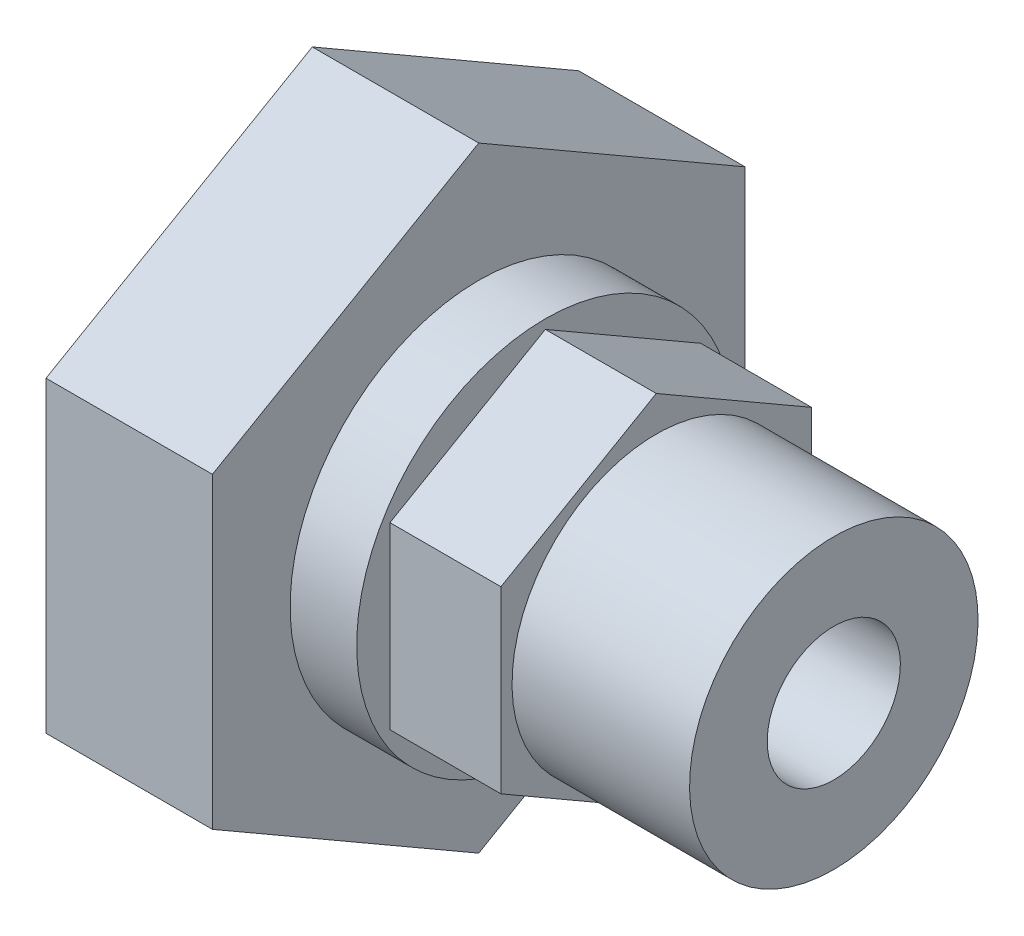
ISO-10303-21;
HEADER;
FILE_DESCRIPTION(('STEP AP214'),'2;1');
FILE_NAME('part.step','',(''),(''),'','','');
FILE_SCHEMA(('AUTOMOTIVE_DESIGN { 1 0 10303 214 1 1 1 1 }'));
ENDSEC;
DATA;
#1=APPLICATION_CONTEXT('core data for automotive mechanical design processes');
#2=APPLICATION_PROTOCOL_DEFINITION('international standard','automotive_design',2000,#1);
#3=PRODUCT_CONTEXT('',#1,'mechanical');
#4=PRODUCT('Part','Part','',(#3));
#5=PRODUCT_RELATED_PRODUCT_CATEGORY('part','',(#4));
#6=PRODUCT_DEFINITION_FORMATION('','',#4);
#7=PRODUCT_DEFINITION_CONTEXT('part definition',#1,'design');
#8=PRODUCT_DEFINITION('design','',#6,#7);
#9=PRODUCT_DEFINITION_SHAPE('','',#8);
#10=(LENGTH_UNIT() NAMED_UNIT(*) SI_UNIT(.MILLI.,.METRE.));
#11=(NAMED_UNIT(*) PLANE_ANGLE_UNIT() SI_UNIT($,.RADIAN.));
#12=(NAMED_UNIT(*) SI_UNIT($,.STERADIAN.) SOLID_ANGLE_UNIT());
#13=UNCERTAINTY_MEASURE_WITH_UNIT(LENGTH_MEASURE(1.E-05),#10,'distance_accuracy_value','');
#14=(GEOMETRIC_REPRESENTATION_CONTEXT(3) GLOBAL_UNCERTAINTY_ASSIGNED_CONTEXT((#13)) GLOBAL_UNIT_ASSIGNED_CONTEXT((#10,
#11,#12)) REPRESENTATION_CONTEXT('',''));
#15=CARTESIAN_POINT('',(0.,0.,0.));
#16=DIRECTION('',(0.,0.,1.));
#17=DIRECTION('',(1.,0.,0.));
#18=AXIS2_PLACEMENT_3D('',#15,#16,#17);
#19=CARTESIAN_POINT('',(15.5,4.04145188432727,-7.));
#20=DIRECTION('',(-1.,0.,0.));
#21=DIRECTION('',(0.,-1.,0.));
#22=AXIS2_PLACEMENT_3D('',#19,#20,#21);
#23=PLANE('',#22);
#24=CARTESIAN_POINT('',(15.5,0.,0.));
#25=DIRECTION('',(-1.,0.,0.));
#26=DIRECTION('',(0.,-1.,0.));
#27=AXIS2_PLACEMENT_3D('',#24,#25,#26);
#28=CIRCLE('',#27,6.50000000000001);
#29=CARTESIAN_POINT('',(15.5,-6.50000000000001,0.));
#30=VERTEX_POINT('',#29);
#31=EDGE_CURVE('E21',#30,#30,#28,.F.);
#32=ORIENTED_EDGE('',*,*,#31,.F.);
#33=EDGE_LOOP('',(#32));
#34=FACE_BOUND('',#33,.T.);
#35=DIRECTION('',(0.,0.499999999999999,-0.866025403784439));
#36=VECTOR('',#35,1.);
#37=CARTESIAN_POINT('',(15.5,8.08290376865478,0.));
#38=LINE('',#37,#36);
#39=CARTESIAN_POINT('',(15.5,8.08290376865476,0.));
#40=VERTEX_POINT('',#39);
#41=CARTESIAN_POINT('',(15.5,4.04145188432745,7.));
#42=VERTEX_POINT('',#41);
#43=EDGE_CURVE('E109',#40,#42,#38,.F.);
#44=ORIENTED_EDGE('',*,*,#43,.T.);
#45=DIRECTION('',(0.,1.,0.));
#46=VECTOR('',#45,1.);
#47=CARTESIAN_POINT('',(15.5,4.04145188432747,7.00000000000002));
#48=LINE('',#47,#46);
#49=CARTESIAN_POINT('',(15.5,-4.04145188432736,7.));
#50=VERTEX_POINT('',#49);
#51=EDGE_CURVE('E174',#42,#50,#48,.F.);
#52=ORIENTED_EDGE('',*,*,#51,.T.);
#53=DIRECTION('',(0.,0.500000000000001,0.866025403784438));
#54=VECTOR('',#53,1.);
#55=CARTESIAN_POINT('',(15.5,-4.04145188432736,7.));
#56=LINE('',#55,#54);
#57=CARTESIAN_POINT('',(15.5,-8.08290376865473,0.));
#58=VERTEX_POINT('',#57);
#59=EDGE_CURVE('E179',#50,#58,#56,.F.);
#60=ORIENTED_EDGE('',*,*,#59,.T.);
#61=DIRECTION('',(0.,-0.499999999999999,0.866025403784439));
#62=VECTOR('',#61,1.);
#63=CARTESIAN_POINT('',(15.5,-8.08290376865473,0.));
#64=LINE('',#63,#62);
#65=CARTESIAN_POINT('',(15.5,-4.04145188432746,-7.));
#66=VERTEX_POINT('',#65);
#67=EDGE_CURVE('E183',#58,#66,#64,.F.);
#68=ORIENTED_EDGE('',*,*,#67,.T.);
#69=DIRECTION('',(0.,-1.,0.));
#70=VECTOR('',#69,1.);
#71=CARTESIAN_POINT('',(15.5,-4.04145188432747,-7.00000000000002));
#72=LINE('',#71,#70);
#73=CARTESIAN_POINT('',(15.5,4.04145188432727,-7.));
#74=VERTEX_POINT('',#73);
#75=EDGE_CURVE('E105',#66,#74,#72,.F.);
#76=ORIENTED_EDGE('',*,*,#75,.T.);
#77=DIRECTION('',(0.,-0.500000000000001,-0.866025403784438));
#78=VECTOR('',#77,1.);
#79=CARTESIAN_POINT('',(15.5,4.04145188432727,-7.));
#80=LINE('',#79,#78);
#81=EDGE_CURVE('E107',#74,#40,#80,.F.);
#82=ORIENTED_EDGE('',*,*,#81,.T.);
#83=EDGE_LOOP('',(#44,#52,#60,#68,#76,#82));
#84=FACE_BOUND('',#83,.T.);
#85=ADVANCED_FACE('F18',(#34,#84),#23,.F.);
#86=CARTESIAN_POINT('',(15.5,8.08290376865478,0.));
#87=DIRECTION('',(0.,-0.866025403784439,-0.499999999999999));
#88=DIRECTION('',(0.,0.499999999999999,-0.866025403784439));
#89=AXIS2_PLACEMENT_3D('',#86,#87,#88);
#90=PLANE('',#89);
#91=DIRECTION('',(1.,0.,0.));
#92=VECTOR('',#91,1.);
#93=CARTESIAN_POINT('',(15.5,4.04145188432747,7.00000000000002));
#94=LINE('',#93,#92);
#95=CARTESIAN_POINT('',(10.5,4.04145188432745,7.));
#96=VERTEX_POINT('',#95);
#97=EDGE_CURVE('E120',#96,#42,#94,.T.);
#98=ORIENTED_EDGE('',*,*,#97,.T.);
#99=ORIENTED_EDGE('',*,*,#43,.F.);
#100=DIRECTION('',(1.,0.,0.));
#101=VECTOR('',#100,1.);
#102=CARTESIAN_POINT('',(15.5,8.08290376865469,0.));
#103=LINE('',#102,#101);
#104=CARTESIAN_POINT('',(10.5,8.08290376865476,0.));
#105=VERTEX_POINT('',#104);
#106=EDGE_CURVE('E114',#40,#105,#103,.F.);
#107=ORIENTED_EDGE('',*,*,#106,.T.);
#108=DIRECTION('',(0.,0.499999999999994,-0.866025403784442));
#109=VECTOR('',#108,1.);
#110=CARTESIAN_POINT('',(10.5,4.04145188432747,7.00000000000002));
#111=LINE('',#110,#109);
#112=EDGE_CURVE('E170',#96,#105,#111,.T.);
#113=ORIENTED_EDGE('',*,*,#112,.F.);
#114=EDGE_LOOP('',(#98,#99,#107,#113));
#115=FACE_BOUND('',#114,.T.);
#116=ADVANCED_FACE('F117',(#115),#90,.F.);
#117=CARTESIAN_POINT('',(15.5,4.04145188432727,-7.));
#118=DIRECTION('',(0.,-0.866025403784438,0.500000000000001));
#119=DIRECTION('',(0.,-0.500000000000001,-0.866025403784438));
#120=AXIS2_PLACEMENT_3D('',#117,#118,#119);
#121=PLANE('',#120);
#122=ORIENTED_EDGE('',*,*,#106,.F.);
#123=ORIENTED_EDGE('',*,*,#81,.F.);
#124=DIRECTION('',(1.,0.,0.));
#125=VECTOR('',#124,1.);
#126=CARTESIAN_POINT('',(15.5,4.04145188432727,-7.00000000000001));
#127=LINE('',#126,#125);
#128=CARTESIAN_POINT('',(10.5,4.04145188432727,-7.));
#129=VERTEX_POINT('',#128);
#130=EDGE_CURVE('E128',#74,#129,#127,.F.);
#131=ORIENTED_EDGE('',*,*,#130,.T.);
#132=DIRECTION('',(0.,-0.500000000000012,-0.866025403784432));
#133=VECTOR('',#132,1.);
#134=CARTESIAN_POINT('',(10.5,8.08290376865478,0.));
#135=LINE('',#134,#133);
#136=EDGE_CURVE('E125',#105,#129,#135,.T.);
#137=ORIENTED_EDGE('',*,*,#136,.F.);
#138=EDGE_LOOP('',(#122,#123,#131,#137));
#139=FACE_BOUND('',#138,.T.);
#140=ADVANCED_FACE('F123',(#139),#121,.F.);
#141=CARTESIAN_POINT('',(15.5,-4.04145188432747,-7.00000000000002));
#142=DIRECTION('',(0.,0.,1.));
#143=DIRECTION('',(0.,-1.,0.));
#144=AXIS2_PLACEMENT_3D('',#141,#142,#143);
#145=PLANE('',#144);
#146=ORIENTED_EDGE('',*,*,#130,.F.);
#147=ORIENTED_EDGE('',*,*,#75,.F.);
#148=DIRECTION('',(1.,0.,0.));
#149=VECTOR('',#148,1.);
#150=CARTESIAN_POINT('',(15.5,-4.04145188432739,-6.99999999999998));
#151=LINE('',#150,#149);
#152=CARTESIAN_POINT('',(10.5,-4.04145188432746,-7.));
#153=VERTEX_POINT('',#152);
#154=EDGE_CURVE('E181',#66,#153,#151,.F.);
#155=ORIENTED_EDGE('',*,*,#154,.T.);
#156=DIRECTION('',(0.,1.,0.));
#157=VECTOR('',#156,1.);
#158=CARTESIAN_POINT('',(10.5,0.,-7.));
#159=LINE('',#158,#157);
#160=EDGE_CURVE('E166',#129,#153,#159,.F.);
#161=ORIENTED_EDGE('',*,*,#160,.F.);
#162=EDGE_LOOP('',(#146,#147,#155,#161));
#163=FACE_BOUND('',#162,.T.);
#164=ADVANCED_FACE('F186',(#163),#145,.F.);
#165=CARTESIAN_POINT('',(15.5,-8.08290376865473,0.));
#166=DIRECTION('',(0.,0.866025403784439,0.499999999999999));
#167=DIRECTION('',(0.,-0.499999999999999,0.866025403784439));
#168=AXIS2_PLACEMENT_3D('',#165,#166,#167);
#169=PLANE('',#168);
#170=ORIENTED_EDGE('',*,*,#154,.F.);
#171=ORIENTED_EDGE('',*,*,#67,.F.);
#172=DIRECTION('',(1.,0.,0.));
#173=VECTOR('',#172,1.);
#174=CARTESIAN_POINT('',(15.5,-8.08290376865476,0.));
#175=LINE('',#174,#173);
#176=CARTESIAN_POINT('',(10.5,-8.08290376865473,0.));
#177=VERTEX_POINT('',#176);
#178=EDGE_CURVE('E177',#58,#177,#175,.F.);
#179=ORIENTED_EDGE('',*,*,#178,.T.);
#180=DIRECTION('',(0.,-0.499999999999988,0.866025403784446));
#181=VECTOR('',#180,1.);
#182=CARTESIAN_POINT('',(10.5,-4.04145188432747,-7.00000000000002));
#183=LINE('',#182,#181);
#184=EDGE_CURVE('E159',#153,#177,#183,.T.);
#185=ORIENTED_EDGE('',*,*,#184,.F.);
#186=EDGE_LOOP('',(#170,#171,#179,#185));
#187=FACE_BOUND('',#186,.T.);
#188=ADVANCED_FACE('F201',(#187),#169,.F.);
#189=CARTESIAN_POINT('',(15.5,-4.04145188432736,7.));
#190=DIRECTION('',(0.,0.866025403784438,-0.500000000000001));
#191=DIRECTION('',(0.,0.500000000000001,0.866025403784438));
#192=AXIS2_PLACEMENT_3D('',#189,#190,#191);
#193=PLANE('',#192);
#194=ORIENTED_EDGE('',*,*,#178,.F.);
#195=ORIENTED_EDGE('',*,*,#59,.F.);
#196=DIRECTION('',(1.,0.,0.));
#197=VECTOR('',#196,1.);
#198=CARTESIAN_POINT('',(15.5,-4.04145188432736,7.));
#199=LINE('',#198,#197);
#200=CARTESIAN_POINT('',(10.5,-4.04145188432736,7.));
#201=VERTEX_POINT('',#200);
#202=EDGE_CURVE('E172',#50,#201,#199,.F.);
#203=ORIENTED_EDGE('',*,*,#202,.T.);
#204=DIRECTION('',(0.,0.499999999999997,0.86602540378444));
#205=VECTOR('',#204,1.);
#206=CARTESIAN_POINT('',(10.5,-8.08290376865473,0.));
#207=LINE('',#206,#205);
#208=EDGE_CURVE('E154',#177,#201,#207,.T.);
#209=ORIENTED_EDGE('',*,*,#208,.F.);
#210=EDGE_LOOP('',(#194,#195,#203,#209));
#211=FACE_BOUND('',#210,.T.);
#212=ADVANCED_FACE('F198',(#211),#193,.F.);
#213=CARTESIAN_POINT('',(15.5,4.04145188432747,7.00000000000002));
#214=DIRECTION('',(0.,0.,-1.));
#215=DIRECTION('',(0.,1.,0.));
#216=AXIS2_PLACEMENT_3D('',#213,#214,#215);
#217=PLANE('',#216);
#218=ORIENTED_EDGE('',*,*,#202,.F.);
#219=ORIENTED_EDGE('',*,*,#51,.F.);
#220=ORIENTED_EDGE('',*,*,#97,.F.);
#221=DIRECTION('',(0.,1.,0.));
#222=VECTOR('',#221,1.);
#223=CARTESIAN_POINT('',(10.5,0.,7.));
#224=LINE('',#223,#222);
#225=EDGE_CURVE('E150',#201,#96,#224,.T.);
#226=ORIENTED_EDGE('',*,*,#225,.F.);
#227=EDGE_LOOP('',(#218,#219,#220,#226));
#228=FACE_BOUND('',#227,.T.);
#229=ADVANCED_FACE('F193',(#228),#217,.F.);
#230=CARTESIAN_POINT('',(23.5,0.,0.));
#231=DIRECTION('',(-1.,0.,0.));
#232=DIRECTION('',(0.,-1.,0.));
#233=AXIS2_PLACEMENT_3D('',#230,#231,#232);
#234=CYLINDRICAL_SURFACE('',#233,6.50000000000001);
#235=ORIENTED_EDGE('',*,*,#31,.T.);
#236=EDGE_LOOP('',(#235));
#237=FACE_BOUND('',#236,.T.);
#238=CARTESIAN_POINT('',(23.5,0.,0.));
#239=DIRECTION('',(-1.,0.,0.));
#240=DIRECTION('',(0.,-1.,0.));
#241=AXIS2_PLACEMENT_3D('',#238,#239,#240);
#242=CIRCLE('',#241,6.50000000000001);
#243=CARTESIAN_POINT('',(23.5,-6.50000000000001,0.));
#244=VERTEX_POINT('',#243);
#245=EDGE_CURVE('E148',#244,#244,#242,.F.);
#246=ORIENTED_EDGE('',*,*,#245,.F.);
#247=EDGE_LOOP('',(#246));
#248=FACE_BOUND('',#247,.T.);
#249=ADVANCED_FACE('F268',(#237,#248),#234,.T.);
#250=CARTESIAN_POINT('',(10.5,0.,0.));
#251=DIRECTION('',(1.,0.,0.));
#252=DIRECTION('',(0.,1.,0.));
#253=AXIS2_PLACEMENT_3D('',#250,#251,#252);
#254=PLANE('',#253);
#255=ORIENTED_EDGE('',*,*,#208,.T.);
#256=ORIENTED_EDGE('',*,*,#225,.T.);
#257=ORIENTED_EDGE('',*,*,#112,.T.);
#258=ORIENTED_EDGE('',*,*,#136,.T.);
#259=ORIENTED_EDGE('',*,*,#160,.T.);
#260=ORIENTED_EDGE('',*,*,#184,.T.);
#261=EDGE_LOOP('',(#255,#256,#257,#258,#259,#260));
#262=FACE_BOUND('',#261,.T.);
#263=CARTESIAN_POINT('',(10.5,0.,0.));
#264=DIRECTION('',(-1.,0.,0.));
#265=DIRECTION('',(0.,-1.,0.));
#266=AXIS2_PLACEMENT_3D('',#263,#264,#265);
#267=CIRCLE('',#266,8.50000000000002);
#268=CARTESIAN_POINT('',(10.5,-8.50000000000002,0.));
#269=VERTEX_POINT('',#268);
#270=EDGE_CURVE('E146',#269,#269,#267,.T.);
#271=ORIENTED_EDGE('',*,*,#270,.F.);
#272=EDGE_LOOP('',(#271));
#273=FACE_BOUND('',#272,.T.);
#274=ADVANCED_FACE('F189',(#262,#273),#254,.T.);
#275=CARTESIAN_POINT('',(23.5,0.,0.));
#276=DIRECTION('',(1.,0.,0.));
#277=DIRECTION('',(0.,1.,0.));
#278=AXIS2_PLACEMENT_3D('',#275,#276,#277);
#279=PLANE('',#278);
#280=CARTESIAN_POINT('',(23.5,0.,0.));
#281=DIRECTION('',(-1.,0.,0.));
#282=DIRECTION('',(0.,-1.,0.));
#283=AXIS2_PLACEMENT_3D('',#280,#281,#282);
#284=CIRCLE('',#283,3.00000000000001);
#285=CARTESIAN_POINT('',(23.5,-3.00000000000001,0.));
#286=VERTEX_POINT('',#285);
#287=EDGE_CURVE('E143',#286,#286,#284,.T.);
#288=ORIENTED_EDGE('',*,*,#287,.T.);
#289=EDGE_LOOP('',(#288));
#290=FACE_BOUND('',#289,.T.);
#291=ORIENTED_EDGE('',*,*,#245,.T.);
#292=EDGE_LOOP('',(#291));
#293=FACE_BOUND('',#292,.T.);
#294=ADVANCED_FACE('F261',(#290,#293),#279,.T.);
#295=CARTESIAN_POINT('',(10.5,0.,0.));
#296=DIRECTION('',(-1.,0.,0.));
#297=DIRECTION('',(0.,-1.,0.));
#298=AXIS2_PLACEMENT_3D('',#295,#296,#297);
#299=CYLINDRICAL_SURFACE('',#298,8.50000000000002);
#300=ORIENTED_EDGE('',*,*,#270,.T.);
#301=EDGE_LOOP('',(#300));
#302=FACE_BOUND('',#301,.T.);
#303=CARTESIAN_POINT('',(7.50000000000001,0.,0.));
#304=DIRECTION('',(-1.,0.,0.));
#305=DIRECTION('',(0.,-1.,0.));
#306=AXIS2_PLACEMENT_3D('',#303,#304,#305);
#307=CIRCLE('',#306,8.50000000000002);
#308=CARTESIAN_POINT('',(7.50000000000001,-8.50000000000002,0.));
#309=VERTEX_POINT('',#308);
#310=EDGE_CURVE('E140',#309,#309,#307,.F.);
#311=ORIENTED_EDGE('',*,*,#310,.T.);
#312=EDGE_LOOP('',(#311));
#313=FACE_BOUND('',#312,.T.);
#314=ADVANCED_FACE('F257',(#302,#313),#299,.T.);
#315=CARTESIAN_POINT('',(23.5,0.,0.));
#316=DIRECTION('',(-1.,0.,0.));
#317=DIRECTION('',(0.,-1.,0.));
#318=AXIS2_PLACEMENT_3D('',#315,#316,#317);
#319=CYLINDRICAL_SURFACE('',#318,3.00000000000001);
#320=CARTESIAN_POINT('',(15.5,0.,0.));
#321=DIRECTION('',(-1.,0.,0.));
#322=DIRECTION('',(0.,-1.,0.));
#323=AXIS2_PLACEMENT_3D('',#320,#321,#322);
#324=CIRCLE('',#323,3.00000000000001);
#325=CARTESIAN_POINT('',(15.5,-3.00000000000001,0.));
#326=VERTEX_POINT('',#325);
#327=EDGE_CURVE('E136',#326,#326,#324,.T.);
#328=ORIENTED_EDGE('',*,*,#327,.T.);
#329=EDGE_LOOP('',(#328));
#330=FACE_BOUND('',#329,.T.);
#331=ORIENTED_EDGE('',*,*,#287,.F.);
#332=EDGE_LOOP('',(#331));
#333=FACE_BOUND('',#332,.T.);
#334=ADVANCED_FACE('F253',(#330,#333),#319,.F.);
#335=CARTESIAN_POINT('',(7.50000000000001,6.92820323027554,-12.));
#336=DIRECTION('',(-1.,0.,0.));
#337=DIRECTION('',(0.,-1.,0.));
#338=AXIS2_PLACEMENT_3D('',#335,#336,#337);
#339=PLANE('',#338);
#340=ORIENTED_EDGE('',*,*,#310,.F.);
#341=EDGE_LOOP('',(#340));
#342=FACE_BOUND('',#341,.T.);
#343=DIRECTION('',(0.,0.499999999999999,-0.866025403784439));
#344=VECTOR('',#343,1.);
#345=CARTESIAN_POINT('',(7.50000000000001,13.856406460551,0.));
#346=LINE('',#345,#344);
#347=CARTESIAN_POINT('',(7.50000000000001,13.856406460551,0.));
#348=VERTEX_POINT('',#347);
#349=CARTESIAN_POINT('',(7.50000000000001,6.92820323027551,12.));
#350=VERTEX_POINT('',#349);
#351=EDGE_CURVE('E426',#348,#350,#346,.F.);
#352=ORIENTED_EDGE('',*,*,#351,.T.);
#353=DIRECTION('',(0.,1.,0.));
#354=VECTOR('',#353,1.);
#355=CARTESIAN_POINT('',(7.50000000000001,6.92820323027549,12.));
#356=LINE('',#355,#354);
#357=CARTESIAN_POINT('',(7.50000000000001,-6.92820323027554,12.));
#358=VERTEX_POINT('',#357);
#359=EDGE_CURVE('E427',#350,#358,#356,.F.);
#360=ORIENTED_EDGE('',*,*,#359,.T.);
#361=DIRECTION('',(0.,0.500000000000001,0.866025403784438));
#362=VECTOR('',#361,1.);
#363=CARTESIAN_POINT('',(7.50000000000001,-6.92820323027554,12.));
#364=LINE('',#363,#362);
#365=CARTESIAN_POINT('',(7.50000000000001,-13.8564064605511,0.));
#366=VERTEX_POINT('',#365);
#367=EDGE_CURVE('E447',#358,#366,#364,.F.);
#368=ORIENTED_EDGE('',*,*,#367,.T.);
#369=DIRECTION('',(0.,-0.499999999999999,0.866025403784439));
#370=VECTOR('',#369,1.);
#371=CARTESIAN_POINT('',(7.50000000000001,-13.8564064605511,0.));
#372=LINE('',#371,#370);
#373=CARTESIAN_POINT('',(7.50000000000001,-6.92820323027556,-12.));
#374=VERTEX_POINT('',#373);
#375=EDGE_CURVE('E451',#366,#374,#372,.F.);
#376=ORIENTED_EDGE('',*,*,#375,.T.);
#377=DIRECTION('',(0.,-1.,0.));
#378=VECTOR('',#377,1.);
#379=CARTESIAN_POINT('',(7.50000000000001,-6.92820323027554,-12.));
#380=LINE('',#379,#378);
#381=CARTESIAN_POINT('',(7.50000000000001,6.92820323027554,-12.));
#382=VERTEX_POINT('',#381);
#383=EDGE_CURVE('E454',#374,#382,#380,.F.);
#384=ORIENTED_EDGE('',*,*,#383,.T.);
#385=DIRECTION('',(0.,-0.500000000000001,-0.866025403784438));
#386=VECTOR('',#385,1.);
#387=CARTESIAN_POINT('',(7.50000000000001,6.92820323027554,-12.));
#388=LINE('',#387,#386);
#389=EDGE_CURVE('E139',#382,#348,#388,.F.);
#390=ORIENTED_EDGE('',*,*,#389,.T.);
#391=EDGE_LOOP('',(#352,#360,#368,#376,#384,#390));
#392=FACE_BOUND('',#391,.T.);
#393=ADVANCED_FACE('F249',(#342,#392),#339,.F.);
#394=CARTESIAN_POINT('',(15.5,0.,0.));
#395=DIRECTION('',(1.,0.,0.));
#396=DIRECTION('',(0.,1.,0.));
#397=AXIS2_PLACEMENT_3D('',#394,#395,#396);
#398=PLANE('',#397);
#399=ORIENTED_EDGE('',*,*,#327,.F.);
#400=EDGE_LOOP('',(#399));
#401=FACE_BOUND('',#400,.T.);
#402=CARTESIAN_POINT('',(15.5,0.,0.));
#403=DIRECTION('',(-1.,0.,0.));
#404=DIRECTION('',(0.,-1.,0.));
#405=AXIS2_PLACEMENT_3D('',#402,#403,#404);
#406=CIRCLE('',#405,4.00000000000001);
#407=CARTESIAN_POINT('',(15.5,-4.00000000000001,0.));
#408=VERTEX_POINT('',#407);
#409=EDGE_CURVE('E132',#408,#408,#406,.T.);
#410=ORIENTED_EDGE('',*,*,#409,.T.);
#411=EDGE_LOOP('',(#410));
#412=FACE_BOUND('',#411,.T.);
#413=ADVANCED_FACE('F245',(#401,#412),#398,.F.);
#414=CARTESIAN_POINT('',(7.50000000000001,6.92820323027554,-12.));
#415=DIRECTION('',(0.,-0.866025403784438,0.500000000000001));
#416=DIRECTION('',(0.,-0.500000000000001,-0.866025403784438));
#417=AXIS2_PLACEMENT_3D('',#414,#415,#416);
#418=PLANE('',#417);
#419=DIRECTION('',(1.,0.,0.));
#420=VECTOR('',#419,1.);
#421=CARTESIAN_POINT('',(7.50000000000001,13.856406460551,0.));
#422=LINE('',#421,#420);
#423=CARTESIAN_POINT('',(0.,13.856406460551,0.));
#424=VERTEX_POINT('',#423);
#425=EDGE_CURVE('E432',#424,#348,#422,.T.);
#426=ORIENTED_EDGE('',*,*,#425,.T.);
#427=ORIENTED_EDGE('',*,*,#389,.F.);
#428=DIRECTION('',(1.,0.,0.));
#429=VECTOR('',#428,1.);
#430=CARTESIAN_POINT('',(7.50000000000001,6.92820323027554,-12.));
#431=LINE('',#430,#429);
#432=CARTESIAN_POINT('',(0.,6.92820323027554,-12.));
#433=VERTEX_POINT('',#432);
#434=EDGE_CURVE('E453',#382,#433,#431,.F.);
#435=ORIENTED_EDGE('',*,*,#434,.T.);
#436=DIRECTION('',(0.,-0.499999999999998,-0.86602540378444));
#437=VECTOR('',#436,1.);
#438=CARTESIAN_POINT('',(0.,13.856406460551,0.));
#439=LINE('',#438,#437);
#440=EDGE_CURVE('E135',#424,#433,#439,.T.);
#441=ORIENTED_EDGE('',*,*,#440,.F.);
#442=EDGE_LOOP('',(#426,#427,#435,#441));
#443=FACE_BOUND('',#442,.T.);
#444=ADVANCED_FACE('F241',(#443),#418,.F.);
#445=CARTESIAN_POINT('',(7.50000000000001,-6.92820323027554,-12.));
#446=DIRECTION('',(0.,0.,1.));
#447=DIRECTION('',(0.,-1.,0.));
#448=AXIS2_PLACEMENT_3D('',#445,#446,#447);
#449=PLANE('',#448);
#450=ORIENTED_EDGE('',*,*,#434,.F.);
#451=ORIENTED_EDGE('',*,*,#383,.F.);
#452=DIRECTION('',(1.,0.,0.));
#453=VECTOR('',#452,1.);
#454=CARTESIAN_POINT('',(7.50000000000001,-6.92820323027557,-12.0000000000001));
#455=LINE('',#454,#453);
#456=CARTESIAN_POINT('',(0.,-6.92820323027556,-12.));
#457=VERTEX_POINT('',#456);
#458=EDGE_CURVE('E449',#374,#457,#455,.F.);
#459=ORIENTED_EDGE('',*,*,#458,.T.);
#460=DIRECTION('',(0.,-1.,0.));
#461=VECTOR('',#460,1.);
#462=CARTESIAN_POINT('',(0.,6.92820323027554,-12.));
#463=LINE('',#462,#461);
#464=EDGE_CURVE('E461',#433,#457,#463,.T.);
#465=ORIENTED_EDGE('',*,*,#464,.F.);
#466=EDGE_LOOP('',(#450,#451,#459,#465));
#467=FACE_BOUND('',#466,.T.);
#468=ADVANCED_FACE('F237',(#467),#449,.F.);
#469=CARTESIAN_POINT('',(7.50000000000001,-13.8564064605511,0.));
#470=DIRECTION('',(0.,0.866025403784439,0.499999999999999));
#471=DIRECTION('',(0.,-0.499999999999999,0.866025403784439));
#472=AXIS2_PLACEMENT_3D('',#469,#470,#471);
#473=PLANE('',#472);
#474=ORIENTED_EDGE('',*,*,#458,.F.);
#475=ORIENTED_EDGE('',*,*,#375,.F.);
#476=DIRECTION('',(1.,0.,0.));
#477=VECTOR('',#476,1.);
#478=CARTESIAN_POINT('',(7.50000000000001,-13.8564064605511,0.));
#479=LINE('',#478,#477);
#480=CARTESIAN_POINT('',(0.,-13.8564064605511,0.));
#481=VERTEX_POINT('',#480);
#482=EDGE_CURVE('E436',#366,#481,#479,.F.);
#483=ORIENTED_EDGE('',*,*,#482,.T.);
#484=DIRECTION('',(0.,-0.500000000000001,0.866025403784438));
#485=VECTOR('',#484,1.);
#486=CARTESIAN_POINT('',(0.,-6.92820323027554,-12.));
#487=LINE('',#486,#485);
#488=EDGE_CURVE('E465',#457,#481,#487,.T.);
#489=ORIENTED_EDGE('',*,*,#488,.F.);
#490=EDGE_LOOP('',(#474,#475,#483,#489));
#491=FACE_BOUND('',#490,.T.);
#492=ADVANCED_FACE('F233',(#491),#473,.F.);
#493=CARTESIAN_POINT('',(7.50000000000001,-6.92820323027554,12.));
#494=DIRECTION('',(0.,0.866025403784438,-0.500000000000001));
#495=DIRECTION('',(0.,0.500000000000001,0.866025403784438));
#496=AXIS2_PLACEMENT_3D('',#493,#494,#495);
#497=PLANE('',#496);
#498=ORIENTED_EDGE('',*,*,#482,.F.);
#499=ORIENTED_EDGE('',*,*,#367,.F.);
#500=DIRECTION('',(1.,0.,0.));
#501=VECTOR('',#500,1.);
#502=CARTESIAN_POINT('',(7.50000000000001,-6.92820323027554,12.));
#503=LINE('',#502,#501);
#504=CARTESIAN_POINT('',(0.,-6.92820323027554,12.));
#505=VERTEX_POINT('',#504);
#506=EDGE_CURVE('E435',#358,#505,#503,.F.);
#507=ORIENTED_EDGE('',*,*,#506,.T.);
#508=DIRECTION('',(0.,0.500000000000001,0.866025403784438));
#509=VECTOR('',#508,1.);
#510=CARTESIAN_POINT('',(0.,-13.8564064605511,0.));
#511=LINE('',#510,#509);
#512=EDGE_CURVE('E469',#481,#505,#511,.T.);
#513=ORIENTED_EDGE('',*,*,#512,.F.);
#514=EDGE_LOOP('',(#498,#499,#507,#513));
#515=FACE_BOUND('',#514,.T.);
#516=ADVANCED_FACE('F230',(#515),#497,.F.);
#517=CARTESIAN_POINT('',(7.50000000000001,6.92820323027549,12.));
#518=DIRECTION('',(0.,0.,-1.));
#519=DIRECTION('',(0.,1.,0.));
#520=AXIS2_PLACEMENT_3D('',#517,#518,#519);
#521=PLANE('',#520);
#522=ORIENTED_EDGE('',*,*,#506,.F.);
#523=ORIENTED_EDGE('',*,*,#359,.F.);
#524=DIRECTION('',(1.,0.,0.));
#525=VECTOR('',#524,1.);
#526=CARTESIAN_POINT('',(7.50000000000001,6.92820323027552,12.));
#527=LINE('',#526,#525);
#528=CARTESIAN_POINT('',(0.,6.92820323027551,12.));
#529=VERTEX_POINT('',#528);
#530=EDGE_CURVE('E36',#350,#529,#527,.F.);
#531=ORIENTED_EDGE('',*,*,#530,.T.);
#532=DIRECTION('',(0.,-1.,0.));
#533=VECTOR('',#532,1.);
#534=CARTESIAN_POINT('',(0.,6.92820323027554,12.));
#535=LINE('',#534,#533);
#536=EDGE_CURVE('E467',#505,#529,#535,.F.);
#537=ORIENTED_EDGE('',*,*,#536,.F.);
#538=EDGE_LOOP('',(#522,#523,#531,#537));
#539=FACE_BOUND('',#538,.T.);
#540=ADVANCED_FACE('F226',(#539),#521,.F.);
#541=CARTESIAN_POINT('',(7.50000000000001,13.856406460551,0.));
#542=DIRECTION('',(0.,-0.866025403784439,-0.499999999999999));
#543=DIRECTION('',(0.,0.499999999999999,-0.866025403784439));
#544=AXIS2_PLACEMENT_3D('',#541,#542,#543);
#545=PLANE('',#544);
#546=ORIENTED_EDGE('',*,*,#530,.F.);
#547=ORIENTED_EDGE('',*,*,#351,.F.);
#548=ORIENTED_EDGE('',*,*,#425,.F.);
#549=DIRECTION('',(0.,0.500000000000001,-0.866025403784438));
#550=VECTOR('',#549,1.);
#551=CARTESIAN_POINT('',(0.,6.92820323027549,12.));
#552=LINE('',#551,#550);
#553=EDGE_CURVE('E27',#529,#424,#552,.T.);
#554=ORIENTED_EDGE('',*,*,#553,.F.);
#555=EDGE_LOOP('',(#546,#547,#548,#554));
#556=FACE_BOUND('',#555,.T.);
#557=ADVANCED_FACE('F219',(#556),#545,.F.);
#558=CARTESIAN_POINT('',(7.50000000000001,0.,0.));
#559=DIRECTION('',(-1.,0.,0.));
#560=DIRECTION('',(0.,-1.,0.));
#561=AXIS2_PLACEMENT_3D('',#558,#559,#560);
#562=CYLINDRICAL_SURFACE('',#561,4.00000000000001);
#563=ORIENTED_EDGE('',*,*,#409,.F.);
#564=EDGE_LOOP('',(#563));
#565=FACE_BOUND('',#564,.T.);
#566=CARTESIAN_POINT('',(0.,0.,0.));
#567=DIRECTION('',(-1.,0.,0.));
#568=DIRECTION('',(0.,-1.,0.));
#569=AXIS2_PLACEMENT_3D('',#566,#567,#568);
#570=CIRCLE('',#569,4.00000000000001);
#571=CARTESIAN_POINT('',(0.,-4.00000000000001,0.));
#572=VERTEX_POINT('',#571);
#573=EDGE_CURVE('E11',#572,#572,#570,.F.);
#574=ORIENTED_EDGE('',*,*,#573,.F.);
#575=EDGE_LOOP('',(#574));
#576=FACE_BOUND('',#575,.T.);
#577=ADVANCED_FACE('F213',(#565,#576),#562,.F.);
#578=CARTESIAN_POINT('',(0.,6.92820323027554,-12.));
#579=DIRECTION('',(-1.,0.,0.));
#580=DIRECTION('',(0.,-1.,0.));
#581=AXIS2_PLACEMENT_3D('',#578,#579,#580);
#582=PLANE('',#581);
#583=ORIENTED_EDGE('',*,*,#573,.T.);
#584=EDGE_LOOP('',(#583));
#585=FACE_BOUND('',#584,.T.);
#586=ORIENTED_EDGE('',*,*,#536,.T.);
#587=ORIENTED_EDGE('',*,*,#553,.T.);
#588=ORIENTED_EDGE('',*,*,#440,.T.);
#589=ORIENTED_EDGE('',*,*,#464,.T.);
#590=ORIENTED_EDGE('',*,*,#488,.T.);
#591=ORIENTED_EDGE('',*,*,#512,.T.);
#592=EDGE_LOOP('',(#586,#587,#588,#589,#590,#591));
#593=FACE_BOUND('',#592,.T.);
#594=ADVANCED_FACE('F211',(#585,#593),#582,.T.);
#595=CLOSED_SHELL('',(#85,#116,#140,#164,#188,#212,#229,#249,#274,#294,#314,#334,#393,#413,#444,
#468,#492,#516,#540,#557,#577,#594));
#596=MANIFOLD_SOLID_BREP('B1',#595);
#597=ADVANCED_BREP_SHAPE_REPRESENTATION('',(#18,#596),#14);
#598=SHAPE_DEFINITION_REPRESENTATION(#9,#597);
ENDSEC;
END-ISO-10303-21;
